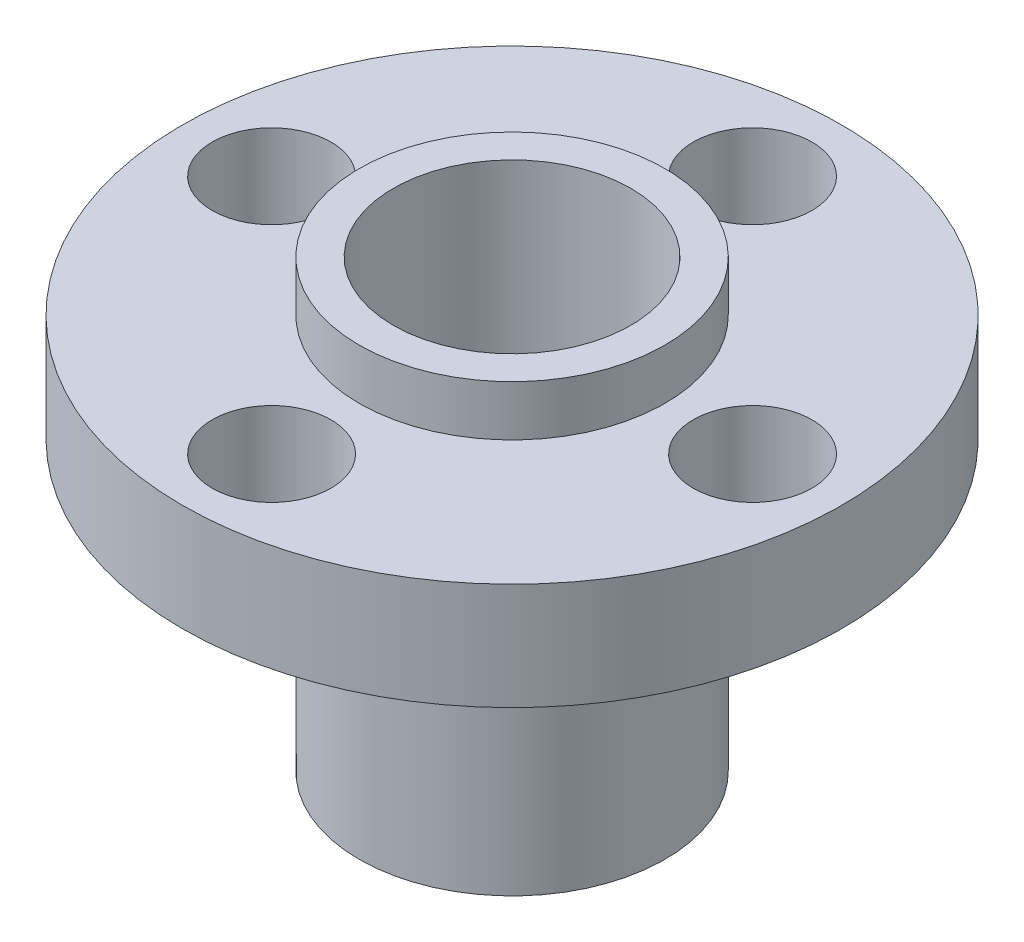
ISO-10303-21;
HEADER;
FILE_DESCRIPTION(('STEP AP214'),'2;1');
FILE_NAME('part.step','',(''),(''),'','','');
FILE_SCHEMA(('AUTOMOTIVE_DESIGN { 1 0 10303 214 1 1 1 1 }'));
ENDSEC;
DATA;
#1=APPLICATION_CONTEXT('core data for automotive mechanical design processes');
#2=APPLICATION_PROTOCOL_DEFINITION('international standard','automotive_design',2000,#1);
#3=PRODUCT_CONTEXT('',#1,'mechanical');
#4=PRODUCT('Part','Part','',(#3));
#5=PRODUCT_RELATED_PRODUCT_CATEGORY('part','',(#4));
#6=PRODUCT_DEFINITION_FORMATION('','',#4);
#7=PRODUCT_DEFINITION_CONTEXT('part definition',#1,'design');
#8=PRODUCT_DEFINITION('design','',#6,#7);
#9=PRODUCT_DEFINITION_SHAPE('','',#8);
#10=(LENGTH_UNIT() NAMED_UNIT(*) SI_UNIT(.MILLI.,.METRE.));
#11=(NAMED_UNIT(*) PLANE_ANGLE_UNIT() SI_UNIT($,.RADIAN.));
#12=(NAMED_UNIT(*) SI_UNIT($,.STERADIAN.) SOLID_ANGLE_UNIT());
#13=UNCERTAINTY_MEASURE_WITH_UNIT(LENGTH_MEASURE(1.E-05),#10,'distance_accuracy_value','');
#14=(GEOMETRIC_REPRESENTATION_CONTEXT(3) GLOBAL_UNCERTAINTY_ASSIGNED_CONTEXT((#13)) GLOBAL_UNIT_ASSIGNED_CONTEXT((#10,
#11,#12)) REPRESENTATION_CONTEXT('',''));
#15=CARTESIAN_POINT('',(0.,0.,0.));
#16=DIRECTION('',(0.,0.,1.));
#17=DIRECTION('',(1.,0.,0.));
#18=AXIS2_PLACEMENT_3D('',#15,#16,#17);
#19=CARTESIAN_POINT('',(0.,3.6,0.));
#20=DIRECTION('',(0.,-1.,0.));
#21=DIRECTION('',(0.,0.,-1.));
#22=AXIS2_PLACEMENT_3D('',#19,#20,#21);
#23=CYLINDRICAL_SURFACE('',#22,11.1);
#24=CARTESIAN_POINT('',(0.,3.6,0.));
#25=DIRECTION('',(0.,1.,0.));
#26=DIRECTION('',(0.,0.,1.));
#27=AXIS2_PLACEMENT_3D('',#24,#25,#26);
#28=CIRCLE('',#27,11.1);
#29=CARTESIAN_POINT('',(0.,3.6,11.1));
#30=VERTEX_POINT('',#29);
#31=EDGE_CURVE('E37',#30,#30,#28,.T.);
#32=ORIENTED_EDGE('',*,*,#31,.F.);
#33=EDGE_LOOP('',(#32));
#34=FACE_BOUND('',#33,.T.);
#35=CARTESIAN_POINT('',(0.,0.,0.));
#36=DIRECTION('',(0.,1.,0.));
#37=DIRECTION('',(0.,0.,1.));
#38=AXIS2_PLACEMENT_3D('',#35,#36,#37);
#39=CIRCLE('',#38,11.1);
#40=CARTESIAN_POINT('',(0.,0.,11.1));
#41=VERTEX_POINT('',#40);
#42=EDGE_CURVE('E42',#41,#41,#39,.T.);
#43=ORIENTED_EDGE('',*,*,#42,.T.);
#44=EDGE_LOOP('',(#43));
#45=FACE_BOUND('',#44,.T.);
#46=ADVANCED_FACE('F30',(#34,#45),#23,.T.);
#47=CARTESIAN_POINT('',(0.,3.6,0.));
#48=DIRECTION('',(0.,1.,0.));
#49=DIRECTION('',(0.,0.,1.));
#50=AXIS2_PLACEMENT_3D('',#47,#48,#49);
#51=PLANE('',#50);
#52=CARTESIAN_POINT('',(-8.1,3.6,0.));
#53=DIRECTION('',(0.,1.,0.));
#54=DIRECTION('',(0.,0.,1.));
#55=AXIS2_PLACEMENT_3D('',#52,#53,#54);
#56=CIRCLE('',#55,2.);
#57=CARTESIAN_POINT('',(-8.1,3.6,2.));
#58=VERTEX_POINT('',#57);
#59=EDGE_CURVE('E75',#58,#58,#56,.T.);
#60=ORIENTED_EDGE('',*,*,#59,.F.);
#61=EDGE_LOOP('',(#60));
#62=FACE_BOUND('',#61,.T.);
#63=CARTESIAN_POINT('',(8.1,3.6,0.));
#64=DIRECTION('',(0.,1.,0.));
#65=DIRECTION('',(0.,0.,1.));
#66=AXIS2_PLACEMENT_3D('',#63,#64,#65);
#67=CIRCLE('',#66,2.);
#68=CARTESIAN_POINT('',(8.1,3.6,2.));
#69=VERTEX_POINT('',#68);
#70=EDGE_CURVE('E63',#69,#69,#67,.T.);
#71=ORIENTED_EDGE('',*,*,#70,.F.);
#72=EDGE_LOOP('',(#71));
#73=FACE_BOUND('',#72,.T.);
#74=CARTESIAN_POINT('',(0.,3.6,-8.1));
#75=DIRECTION('',(0.,1.,0.));
#76=DIRECTION('',(0.,0.,1.));
#77=AXIS2_PLACEMENT_3D('',#74,#75,#76);
#78=CIRCLE('',#77,2.);
#79=CARTESIAN_POINT('',(0.,3.6,-6.1));
#80=VERTEX_POINT('',#79);
#81=EDGE_CURVE('E60',#80,#80,#78,.T.);
#82=ORIENTED_EDGE('',*,*,#81,.F.);
#83=EDGE_LOOP('',(#82));
#84=FACE_BOUND('',#83,.T.);
#85=CARTESIAN_POINT('',(0.,3.6,8.1));
#86=DIRECTION('',(0.,1.,0.));
#87=DIRECTION('',(0.,0.,1.));
#88=AXIS2_PLACEMENT_3D('',#85,#86,#87);
#89=CIRCLE('',#88,2.);
#90=CARTESIAN_POINT('',(0.,3.6,10.1));
#91=VERTEX_POINT('',#90);
#92=EDGE_CURVE('E56',#91,#91,#89,.T.);
#93=ORIENTED_EDGE('',*,*,#92,.F.);
#94=EDGE_LOOP('',(#93));
#95=FACE_BOUND('',#94,.T.);
#96=CARTESIAN_POINT('',(0.,3.6,0.));
#97=DIRECTION('',(0.,1.,0.));
#98=DIRECTION('',(0.,0.,1.));
#99=AXIS2_PLACEMENT_3D('',#96,#97,#98);
#100=CIRCLE('',#99,5.15);
#101=CARTESIAN_POINT('',(0.,3.6,5.15));
#102=VERTEX_POINT('',#101);
#103=EDGE_CURVE('E10',#102,#102,#100,.T.);
#104=ORIENTED_EDGE('',*,*,#103,.F.);
#105=EDGE_LOOP('',(#104));
#106=FACE_BOUND('',#105,.T.);
#107=ORIENTED_EDGE('',*,*,#31,.T.);
#108=EDGE_LOOP('',(#107));
#109=FACE_BOUND('',#108,.T.);
#110=ADVANCED_FACE('F98',(#62,#73,#84,#95,#106,#109),#51,.T.);
#111=CARTESIAN_POINT('',(0.,0.,0.));
#112=DIRECTION('',(0.,1.,0.));
#113=DIRECTION('',(0.,0.,1.));
#114=AXIS2_PLACEMENT_3D('',#111,#112,#113);
#115=PLANE('',#114);
#116=CARTESIAN_POINT('',(-8.1,0.,0.));
#117=DIRECTION('',(0.,1.,0.));
#118=DIRECTION('',(0.,0.,1.));
#119=AXIS2_PLACEMENT_3D('',#116,#117,#118);
#120=CIRCLE('',#119,2.);
#121=CARTESIAN_POINT('',(-8.1,0.,2.));
#122=VERTEX_POINT('',#121);
#123=EDGE_CURVE('E33',#122,#122,#120,.T.);
#124=ORIENTED_EDGE('',*,*,#123,.T.);
#125=EDGE_LOOP('',(#124));
#126=FACE_BOUND('',#125,.T.);
#127=CARTESIAN_POINT('',(8.1,0.,0.));
#128=DIRECTION('',(0.,1.,0.));
#129=DIRECTION('',(0.,0.,1.));
#130=AXIS2_PLACEMENT_3D('',#127,#128,#129);
#131=CIRCLE('',#130,2.);
#132=CARTESIAN_POINT('',(8.1,0.,2.));
#133=VERTEX_POINT('',#132);
#134=EDGE_CURVE('E61',#133,#133,#131,.T.);
#135=ORIENTED_EDGE('',*,*,#134,.T.);
#136=EDGE_LOOP('',(#135));
#137=FACE_BOUND('',#136,.T.);
#138=CARTESIAN_POINT('',(0.,0.,-8.1));
#139=DIRECTION('',(0.,1.,0.));
#140=DIRECTION('',(0.,0.,1.));
#141=AXIS2_PLACEMENT_3D('',#138,#139,#140);
#142=CIRCLE('',#141,2.);
#143=CARTESIAN_POINT('',(0.,0.,-6.1));
#144=VERTEX_POINT('',#143);
#145=EDGE_CURVE('E58',#144,#144,#142,.T.);
#146=ORIENTED_EDGE('',*,*,#145,.T.);
#147=EDGE_LOOP('',(#146));
#148=FACE_BOUND('',#147,.T.);
#149=CARTESIAN_POINT('',(0.,0.,8.1));
#150=DIRECTION('',(0.,1.,0.));
#151=DIRECTION('',(0.,0.,1.));
#152=AXIS2_PLACEMENT_3D('',#149,#150,#151);
#153=CIRCLE('',#152,2.);
#154=CARTESIAN_POINT('',(0.,0.,10.1));
#155=VERTEX_POINT('',#154);
#156=EDGE_CURVE('E53',#155,#155,#153,.T.);
#157=ORIENTED_EDGE('',*,*,#156,.T.);
#158=EDGE_LOOP('',(#157));
#159=FACE_BOUND('',#158,.T.);
#160=CARTESIAN_POINT('',(0.,0.,0.));
#161=DIRECTION('',(0.,1.,0.));
#162=DIRECTION('',(0.,0.,1.));
#163=AXIS2_PLACEMENT_3D('',#160,#161,#162);
#164=CIRCLE('',#163,5.15);
#165=CARTESIAN_POINT('',(0.,0.,5.15));
#166=VERTEX_POINT('',#165);
#167=EDGE_CURVE('E50',#166,#166,#164,.T.);
#168=ORIENTED_EDGE('',*,*,#167,.T.);
#169=EDGE_LOOP('',(#168));
#170=FACE_BOUND('',#169,.T.);
#171=ORIENTED_EDGE('',*,*,#42,.F.);
#172=EDGE_LOOP('',(#171));
#173=FACE_BOUND('',#172,.T.);
#174=ADVANCED_FACE('F89',(#126,#137,#148,#159,#170,#173),#115,.F.);
#175=CARTESIAN_POINT('',(0.,-9.7,0.));
#176=DIRECTION('',(0.,1.,0.));
#177=DIRECTION('',(0.,0.,1.));
#178=AXIS2_PLACEMENT_3D('',#175,#176,#177);
#179=PLANE('',#178);
#180=CARTESIAN_POINT('',(0.,-9.7,0.));
#181=DIRECTION('',(0.,1.,0.));
#182=DIRECTION('',(0.,0.,1.));
#183=AXIS2_PLACEMENT_3D('',#180,#181,#182);
#184=CIRCLE('',#183,4.);
#185=CARTESIAN_POINT('',(0.,-9.7,4.));
#186=VERTEX_POINT('',#185);
#187=EDGE_CURVE('E57',#186,#186,#184,.T.);
#188=ORIENTED_EDGE('',*,*,#187,.T.);
#189=EDGE_LOOP('',(#188));
#190=FACE_BOUND('',#189,.T.);
#191=CARTESIAN_POINT('',(0.,-9.7,0.));
#192=DIRECTION('',(0.,1.,0.));
#193=DIRECTION('',(0.,0.,1.));
#194=AXIS2_PLACEMENT_3D('',#191,#192,#193);
#195=CIRCLE('',#194,5.15);
#196=CARTESIAN_POINT('',(0.,-9.7,5.15));
#197=VERTEX_POINT('',#196);
#198=EDGE_CURVE('E45',#197,#197,#195,.T.);
#199=ORIENTED_EDGE('',*,*,#198,.F.);
#200=EDGE_LOOP('',(#199));
#201=FACE_BOUND('',#200,.T.);
#202=ADVANCED_FACE('F87',(#190,#201),#179,.F.);
#203=CARTESIAN_POINT('',(0.,-9.7,0.));
#204=DIRECTION('',(0.,1.,0.));
#205=DIRECTION('',(0.,0.,1.));
#206=AXIS2_PLACEMENT_3D('',#203,#204,#205);
#207=CYLINDRICAL_SURFACE('',#206,5.15);
#208=ORIENTED_EDGE('',*,*,#198,.T.);
#209=EDGE_LOOP('',(#208));
#210=FACE_BOUND('',#209,.T.);
#211=ORIENTED_EDGE('',*,*,#167,.F.);
#212=EDGE_LOOP('',(#211));
#213=FACE_BOUND('',#212,.T.);
#214=ADVANCED_FACE('F84',(#210,#213),#207,.T.);
#215=ORIENTED_EDGE('',*,*,#103,.T.);
#216=EDGE_LOOP('',(#215));
#217=FACE_BOUND('',#216,.T.);
#218=CARTESIAN_POINT('',(0.,5.3,0.));
#219=DIRECTION('',(0.,1.,0.));
#220=DIRECTION('',(0.,0.,1.));
#221=AXIS2_PLACEMENT_3D('',#218,#219,#220);
#222=CIRCLE('',#221,5.15);
#223=CARTESIAN_POINT('',(0.,5.3,5.15));
#224=VERTEX_POINT('',#223);
#225=EDGE_CURVE('E77',#224,#224,#222,.T.);
#226=ORIENTED_EDGE('',*,*,#225,.F.);
#227=EDGE_LOOP('',(#226));
#228=FACE_BOUND('',#227,.T.);
#229=ADVANCED_FACE('F96',(#217,#228),#207,.T.);
#230=CARTESIAN_POINT('',(0.,5.3,0.));
#231=DIRECTION('',(0.,1.,0.));
#232=DIRECTION('',(0.,0.,1.));
#233=AXIS2_PLACEMENT_3D('',#230,#231,#232);
#234=PLANE('',#233);
#235=CARTESIAN_POINT('',(0.,5.3,0.));
#236=DIRECTION('',(0.,1.,0.));
#237=DIRECTION('',(0.,0.,1.));
#238=AXIS2_PLACEMENT_3D('',#235,#236,#237);
#239=CIRCLE('',#238,4.);
#240=CARTESIAN_POINT('',(0.,5.3,4.));
#241=VERTEX_POINT('',#240);
#242=EDGE_CURVE('E228',#241,#241,#239,.T.);
#243=ORIENTED_EDGE('',*,*,#242,.F.);
#244=EDGE_LOOP('',(#243));
#245=FACE_BOUND('',#244,.T.);
#246=ORIENTED_EDGE('',*,*,#225,.T.);
#247=EDGE_LOOP('',(#246));
#248=FACE_BOUND('',#247,.T.);
#249=ADVANCED_FACE('F119',(#245,#248),#234,.T.);
#250=CARTESIAN_POINT('',(0.,-9.7,0.));
#251=DIRECTION('',(0.,1.,0.));
#252=DIRECTION('',(0.,0.,1.));
#253=AXIS2_PLACEMENT_3D('',#250,#251,#252);
#254=CYLINDRICAL_SURFACE('',#253,4.);
#255=ORIENTED_EDGE('',*,*,#187,.F.);
#256=EDGE_LOOP('',(#255));
#257=FACE_BOUND('',#256,.T.);
#258=ORIENTED_EDGE('',*,*,#242,.T.);
#259=EDGE_LOOP('',(#258));
#260=FACE_BOUND('',#259,.T.);
#261=ADVANCED_FACE('F123',(#257,#260),#254,.F.);
#262=CARTESIAN_POINT('',(0.,-9.7,8.1));
#263=DIRECTION('',(0.,1.,0.));
#264=DIRECTION('',(0.,0.,1.));
#265=AXIS2_PLACEMENT_3D('',#262,#263,#264);
#266=CYLINDRICAL_SURFACE('',#265,2.);
#267=ORIENTED_EDGE('',*,*,#92,.T.);
#268=EDGE_LOOP('',(#267));
#269=FACE_BOUND('',#268,.T.);
#270=ORIENTED_EDGE('',*,*,#156,.F.);
#271=EDGE_LOOP('',(#270));
#272=FACE_BOUND('',#271,.T.);
#273=ADVANCED_FACE('F129',(#269,#272),#266,.F.);
#274=CARTESIAN_POINT('',(0.,-9.7,-8.1));
#275=DIRECTION('',(0.,1.,0.));
#276=DIRECTION('',(0.,0.,1.));
#277=AXIS2_PLACEMENT_3D('',#274,#275,#276);
#278=CYLINDRICAL_SURFACE('',#277,2.);
#279=ORIENTED_EDGE('',*,*,#81,.T.);
#280=EDGE_LOOP('',(#279));
#281=FACE_BOUND('',#280,.T.);
#282=ORIENTED_EDGE('',*,*,#145,.F.);
#283=EDGE_LOOP('',(#282));
#284=FACE_BOUND('',#283,.T.);
#285=ADVANCED_FACE('F138',(#281,#284),#278,.F.);
#286=CARTESIAN_POINT('',(8.1,-9.7,0.));
#287=DIRECTION('',(0.,1.,0.));
#288=DIRECTION('',(0.,0.,1.));
#289=AXIS2_PLACEMENT_3D('',#286,#287,#288);
#290=CYLINDRICAL_SURFACE('',#289,2.);
#291=ORIENTED_EDGE('',*,*,#70,.T.);
#292=EDGE_LOOP('',(#291));
#293=FACE_BOUND('',#292,.T.);
#294=ORIENTED_EDGE('',*,*,#134,.F.);
#295=EDGE_LOOP('',(#294));
#296=FACE_BOUND('',#295,.T.);
#297=ADVANCED_FACE('F134',(#293,#296),#290,.F.);
#298=CARTESIAN_POINT('',(-8.1,-9.7,0.));
#299=DIRECTION('',(0.,1.,0.));
#300=DIRECTION('',(0.,0.,1.));
#301=AXIS2_PLACEMENT_3D('',#298,#299,#300);
#302=CYLINDRICAL_SURFACE('',#301,2.);
#303=ORIENTED_EDGE('',*,*,#59,.T.);
#304=EDGE_LOOP('',(#303));
#305=FACE_BOUND('',#304,.T.);
#306=ORIENTED_EDGE('',*,*,#123,.F.);
#307=EDGE_LOOP('',(#306));
#308=FACE_BOUND('',#307,.T.);
#309=ADVANCED_FACE('F137',(#305,#308),#302,.F.);
#310=CLOSED_SHELL('',(#46,#110,#174,#202,#214,#229,#249,#261,#273,#285,#297,#309));
#311=MANIFOLD_SOLID_BREP('B2',#310);
#312=ADVANCED_BREP_SHAPE_REPRESENTATION('',(#18,#311),#14);
#313=SHAPE_DEFINITION_REPRESENTATION(#9,#312);
ENDSEC;
END-ISO-10303-21;
